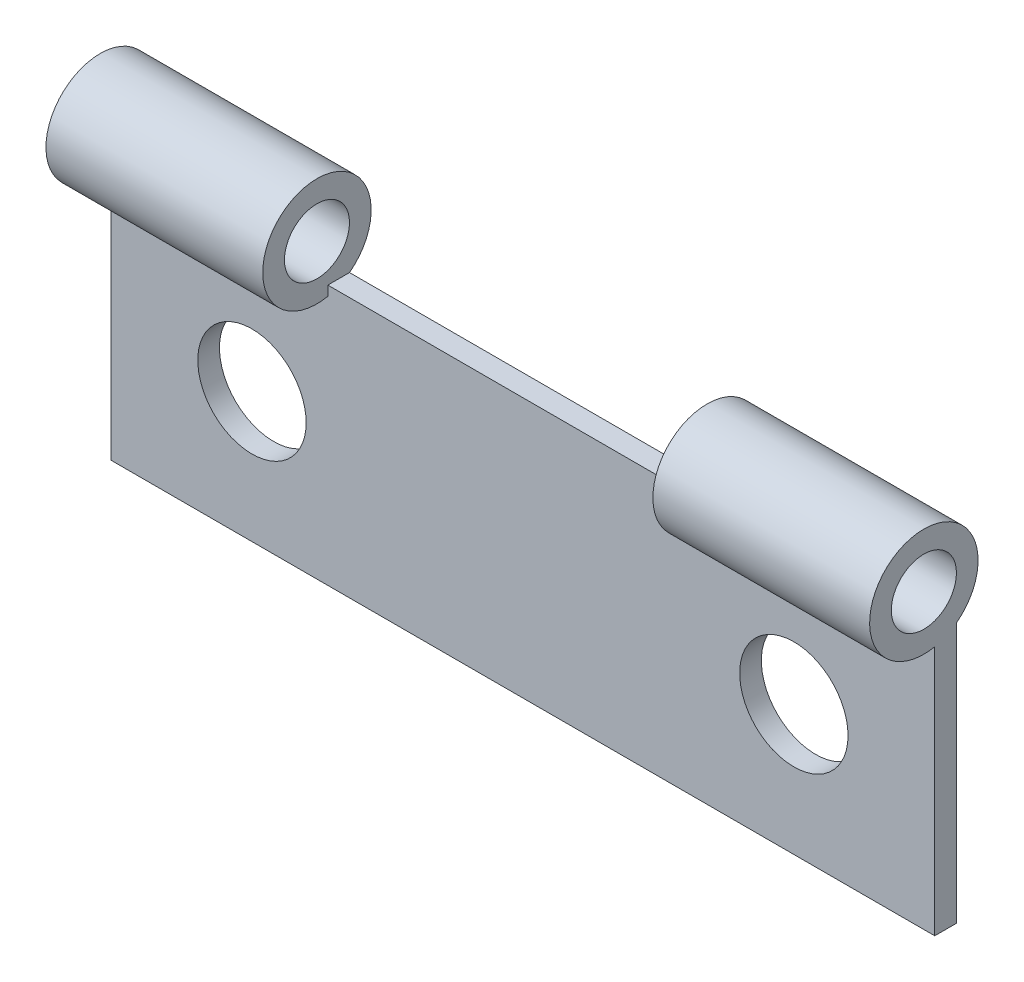
ISO-10303-21;
HEADER;
FILE_DESCRIPTION(('STEP AP214'),'2;1');
FILE_NAME('part.step','',(''),(''),'','','');
FILE_SCHEMA(('AUTOMOTIVE_DESIGN { 1 0 10303 214 1 1 1 1 }'));
ENDSEC;
DATA;
#1=APPLICATION_CONTEXT('core data for automotive mechanical design processes');
#2=APPLICATION_PROTOCOL_DEFINITION('international standard','automotive_design',2000,#1);
#3=PRODUCT_CONTEXT('',#1,'mechanical');
#4=PRODUCT('Part','Part','',(#3));
#5=PRODUCT_RELATED_PRODUCT_CATEGORY('part','',(#4));
#6=PRODUCT_DEFINITION_FORMATION('','',#4);
#7=PRODUCT_DEFINITION_CONTEXT('part definition',#1,'design');
#8=PRODUCT_DEFINITION('design','',#6,#7);
#9=PRODUCT_DEFINITION_SHAPE('','',#8);
#10=(LENGTH_UNIT() NAMED_UNIT(*) SI_UNIT(.MILLI.,.METRE.));
#11=(NAMED_UNIT(*) PLANE_ANGLE_UNIT() SI_UNIT($,.RADIAN.));
#12=(NAMED_UNIT(*) SI_UNIT($,.STERADIAN.) SOLID_ANGLE_UNIT());
#13=UNCERTAINTY_MEASURE_WITH_UNIT(LENGTH_MEASURE(1.E-05),#10,'distance_accuracy_value','');
#14=(GEOMETRIC_REPRESENTATION_CONTEXT(3) GLOBAL_UNCERTAINTY_ASSIGNED_CONTEXT((#13)) GLOBAL_UNIT_ASSIGNED_CONTEXT((#10,
#11,#12)) REPRESENTATION_CONTEXT('',''));
#15=CARTESIAN_POINT('',(0.,0.,0.));
#16=DIRECTION('',(0.,0.,1.));
#17=DIRECTION('',(1.,0.,0.));
#18=AXIS2_PLACEMENT_3D('',#15,#16,#17);
#19=CARTESIAN_POINT('',(0.,0.,1.));
#20=DIRECTION('',(0.,0.,-1.));
#21=DIRECTION('',(-1.,0.,0.));
#22=AXIS2_PLACEMENT_3D('',#19,#20,#21);
#23=PLANE('',#22);
#24=CARTESIAN_POINT('',(12.5,0.,1.));
#25=DIRECTION('',(0.,0.,1.));
#26=DIRECTION('',(1.,0.,0.));
#27=AXIS2_PLACEMENT_3D('',#24,#25,#26);
#28=CIRCLE('',#27,2.5);
#29=CARTESIAN_POINT('',(15.,0.,1.));
#30=VERTEX_POINT('',#29);
#31=EDGE_CURVE('E148',#30,#30,#28,.T.);
#32=ORIENTED_EDGE('',*,*,#31,.F.);
#33=EDGE_LOOP('',(#32));
#34=FACE_BOUND('',#33,.T.);
#35=CARTESIAN_POINT('',(-12.5,0.,1.));
#36=DIRECTION('',(0.,0.,1.));
#37=DIRECTION('',(1.,0.,0.));
#38=AXIS2_PLACEMENT_3D('',#35,#36,#37);
#39=CIRCLE('',#38,2.5);
#40=CARTESIAN_POINT('',(-10.,0.,1.));
#41=VERTEX_POINT('',#40);
#42=EDGE_CURVE('E142',#41,#41,#39,.T.);
#43=ORIENTED_EDGE('',*,*,#42,.F.);
#44=EDGE_LOOP('',(#43));
#45=FACE_BOUND('',#44,.T.);
#46=DIRECTION('',(0.,-1.,0.));
#47=VECTOR('',#46,1.);
#48=CARTESIAN_POINT('',(9.,0.,1.));
#49=LINE('',#48,#47);
#50=CARTESIAN_POINT('',(9.,6.,1.));
#51=VERTEX_POINT('',#50);
#52=CARTESIAN_POINT('',(9.,5.55084963734132,1.));
#53=VERTEX_POINT('',#52);
#54=EDGE_CURVE('E51',#51,#53,#49,.T.);
#55=ORIENTED_EDGE('',*,*,#54,.F.);
#56=DIRECTION('',(-1.,0.,0.));
#57=VECTOR('',#56,1.);
#58=CARTESIAN_POINT('',(-19.,6.,1.));
#59=LINE('',#58,#57);
#60=CARTESIAN_POINT('',(-9.,6.,1.));
#61=VERTEX_POINT('',#60);
#62=EDGE_CURVE('E98',#51,#61,#59,.T.);
#63=ORIENTED_EDGE('',*,*,#62,.T.);
#64=DIRECTION('',(0.,1.,0.));
#65=VECTOR('',#64,1.);
#66=CARTESIAN_POINT('',(-9.,0.,1.));
#67=LINE('',#66,#65);
#68=CARTESIAN_POINT('',(-9.,5.55084963734132,1.));
#69=VERTEX_POINT('',#68);
#70=EDGE_CURVE('E138',#69,#61,#67,.T.);
#71=ORIENTED_EDGE('',*,*,#70,.F.);
#72=DIRECTION('',(1.,0.,0.));
#73=VECTOR('',#72,1.);
#74=CARTESIAN_POINT('',(-19.,5.55084963734132,1.));
#75=LINE('',#74,#73);
#76=CARTESIAN_POINT('',(-19.,5.55084963734132,1.));
#77=VERTEX_POINT('',#76);
#78=EDGE_CURVE('E135',#77,#69,#75,.T.);
#79=ORIENTED_EDGE('',*,*,#78,.F.);
#80=DIRECTION('',(0.,-1.,0.));
#81=VECTOR('',#80,1.);
#82=CARTESIAN_POINT('',(-19.,-6.,1.));
#83=LINE('',#82,#81);
#84=CARTESIAN_POINT('',(-19.,-6.,1.));
#85=VERTEX_POINT('',#84);
#86=EDGE_CURVE('E158',#77,#85,#83,.T.);
#87=ORIENTED_EDGE('',*,*,#86,.T.);
#88=DIRECTION('',(1.,0.,0.));
#89=VECTOR('',#88,1.);
#90=CARTESIAN_POINT('',(-19.,-6.,1.));
#91=LINE('',#90,#89);
#92=CARTESIAN_POINT('',(19.,-6.,1.));
#93=VERTEX_POINT('',#92);
#94=EDGE_CURVE('E160',#85,#93,#91,.T.);
#95=ORIENTED_EDGE('',*,*,#94,.T.);
#96=DIRECTION('',(0.,1.,0.));
#97=VECTOR('',#96,1.);
#98=CARTESIAN_POINT('',(19.,-6.,1.));
#99=LINE('',#98,#97);
#100=CARTESIAN_POINT('',(19.,5.55084963734132,1.));
#101=VERTEX_POINT('',#100);
#102=EDGE_CURVE('E154',#93,#101,#99,.T.);
#103=ORIENTED_EDGE('',*,*,#102,.T.);
#104=DIRECTION('',(-1.,0.,0.));
#105=VECTOR('',#104,1.);
#106=CARTESIAN_POINT('',(19.,5.55084963734132,1.));
#107=LINE('',#106,#105);
#108=EDGE_CURVE('E47',#53,#101,#107,.F.);
#109=ORIENTED_EDGE('',*,*,#108,.F.);
#110=EDGE_LOOP('',(#55,#63,#71,#79,#87,#95,#103,#109));
#111=FACE_BOUND('',#110,.T.);
#112=ADVANCED_FACE('F32',(#34,#45,#111),#23,.F.);
#113=CARTESIAN_POINT('',(-19.,6.,1.));
#114=DIRECTION('',(0.,-1.,0.));
#115=DIRECTION('',(0.,0.,-1.));
#116=AXIS2_PLACEMENT_3D('',#113,#114,#115);
#117=PLANE('',#116);
#118=DIRECTION('',(0.,0.,1.));
#119=VECTOR('',#118,1.);
#120=CARTESIAN_POINT('',(9.,6.,1.));
#121=LINE('',#120,#119);
#122=CARTESIAN_POINT('',(9.,6.,0.00123140658122895));
#123=VERTEX_POINT('',#122);
#124=EDGE_CURVE('E11',#123,#51,#121,.T.);
#125=ORIENTED_EDGE('',*,*,#124,.F.);
#126=DIRECTION('',(-1.,0.,0.));
#127=VECTOR('',#126,1.);
#128=CARTESIAN_POINT('',(19.,6.,0.00123140658122851));
#129=LINE('',#128,#127);
#130=CARTESIAN_POINT('',(19.,6.,0.00123140658122851));
#131=VERTEX_POINT('',#130);
#132=EDGE_CURVE('E95',#131,#123,#129,.T.);
#133=ORIENTED_EDGE('',*,*,#132,.F.);
#134=DIRECTION('',(0.,0.,-1.));
#135=VECTOR('',#134,1.);
#136=CARTESIAN_POINT('',(19.,6.,1.));
#137=LINE('',#136,#135);
#138=CARTESIAN_POINT('',(19.,6.,0.));
#139=VERTEX_POINT('',#138);
#140=EDGE_CURVE('E178',#131,#139,#137,.T.);
#141=ORIENTED_EDGE('',*,*,#140,.T.);
#142=DIRECTION('',(-1.,0.,0.));
#143=VECTOR('',#142,1.);
#144=CARTESIAN_POINT('',(-19.,6.,0.));
#145=LINE('',#144,#143);
#146=CARTESIAN_POINT('',(-19.,6.,0.));
#147=VERTEX_POINT('',#146);
#148=EDGE_CURVE('E165',#139,#147,#145,.T.);
#149=ORIENTED_EDGE('',*,*,#148,.T.);
#150=DIRECTION('',(0.,0.,-1.));
#151=VECTOR('',#150,1.);
#152=CARTESIAN_POINT('',(-19.,6.,1.));
#153=LINE('',#152,#151);
#154=CARTESIAN_POINT('',(-19.,6.,0.00123140658122895));
#155=VERTEX_POINT('',#154);
#156=EDGE_CURVE('E176',#155,#147,#153,.T.);
#157=ORIENTED_EDGE('',*,*,#156,.F.);
#158=DIRECTION('',(1.,0.,0.));
#159=VECTOR('',#158,1.);
#160=CARTESIAN_POINT('',(-19.,6.,0.00123140658122851));
#161=LINE('',#160,#159);
#162=CARTESIAN_POINT('',(-9.,6.,0.00123140658122851));
#163=VERTEX_POINT('',#162);
#164=EDGE_CURVE('E130',#163,#155,#161,.F.);
#165=ORIENTED_EDGE('',*,*,#164,.F.);
#166=DIRECTION('',(0.,0.,-1.));
#167=VECTOR('',#166,1.);
#168=CARTESIAN_POINT('',(-9.,6.,1.));
#169=LINE('',#168,#167);
#170=EDGE_CURVE('E40',#61,#163,#169,.T.);
#171=ORIENTED_EDGE('',*,*,#170,.F.);
#172=ORIENTED_EDGE('',*,*,#62,.F.);
#173=EDGE_LOOP('',(#125,#133,#141,#149,#157,#165,#171,#172));
#174=FACE_BOUND('',#173,.T.);
#175=ADVANCED_FACE('F94',(#174),#117,.F.);
#176=CARTESIAN_POINT('',(0.,0.,0.));
#177=DIRECTION('',(0.,0.,-1.));
#178=DIRECTION('',(-1.,0.,0.));
#179=AXIS2_PLACEMENT_3D('',#176,#177,#178);
#180=PLANE('',#179);
#181=CARTESIAN_POINT('',(12.5,0.,0.));
#182=DIRECTION('',(0.,0.,1.));
#183=DIRECTION('',(1.,0.,0.));
#184=AXIS2_PLACEMENT_3D('',#181,#182,#183);
#185=CIRCLE('',#184,2.5);
#186=CARTESIAN_POINT('',(15.,0.,0.));
#187=VERTEX_POINT('',#186);
#188=EDGE_CURVE('E145',#187,#187,#185,.T.);
#189=ORIENTED_EDGE('',*,*,#188,.T.);
#190=EDGE_LOOP('',(#189));
#191=FACE_BOUND('',#190,.T.);
#192=DIRECTION('',(0.,1.,0.));
#193=VECTOR('',#192,1.);
#194=CARTESIAN_POINT('',(19.,-6.,0.));
#195=LINE('',#194,#193);
#196=CARTESIAN_POINT('',(19.,-6.,0.));
#197=VERTEX_POINT('',#196);
#198=EDGE_CURVE('E151',#197,#139,#195,.T.);
#199=ORIENTED_EDGE('',*,*,#198,.F.);
#200=DIRECTION('',(1.,0.,0.));
#201=VECTOR('',#200,1.);
#202=CARTESIAN_POINT('',(-19.,-6.,0.));
#203=LINE('',#202,#201);
#204=CARTESIAN_POINT('',(-19.,-6.,0.));
#205=VERTEX_POINT('',#204);
#206=EDGE_CURVE('E156',#205,#197,#203,.T.);
#207=ORIENTED_EDGE('',*,*,#206,.F.);
#208=DIRECTION('',(0.,-1.,0.));
#209=VECTOR('',#208,1.);
#210=CARTESIAN_POINT('',(-19.,-6.,0.));
#211=LINE('',#210,#209);
#212=EDGE_CURVE('E168',#147,#205,#211,.T.);
#213=ORIENTED_EDGE('',*,*,#212,.F.);
#214=ORIENTED_EDGE('',*,*,#148,.F.);
#215=EDGE_LOOP('',(#199,#207,#213,#214));
#216=FACE_BOUND('',#215,.T.);
#217=CARTESIAN_POINT('',(-12.5,0.,0.));
#218=DIRECTION('',(0.,0.,1.));
#219=DIRECTION('',(1.,0.,0.));
#220=AXIS2_PLACEMENT_3D('',#217,#218,#219);
#221=CIRCLE('',#220,2.5);
#222=CARTESIAN_POINT('',(-10.,0.,0.));
#223=VERTEX_POINT('',#222);
#224=EDGE_CURVE('E141',#223,#223,#221,.T.);
#225=ORIENTED_EDGE('',*,*,#224,.T.);
#226=EDGE_LOOP('',(#225));
#227=FACE_BOUND('',#226,.T.);
#228=ADVANCED_FACE('F203',(#191,#216,#227),#180,.T.);
#229=CARTESIAN_POINT('',(19.,-6.,1.));
#230=DIRECTION('',(-1.,0.,0.));
#231=DIRECTION('',(0.,0.,1.));
#232=AXIS2_PLACEMENT_3D('',#229,#230,#231);
#233=PLANE('',#232);
#234=ORIENTED_EDGE('',*,*,#140,.F.);
#235=CARTESIAN_POINT('',(19.,8.00184692044318,1.50184692044318));
#236=DIRECTION('',(1.,0.,0.));
#237=DIRECTION('',(0.,0.,-1.));
#238=AXIS2_PLACEMENT_3D('',#235,#236,#237);
#239=CIRCLE('',#238,2.50184692044318);
#240=EDGE_CURVE('E107',#131,#101,#239,.T.);
#241=ORIENTED_EDGE('',*,*,#240,.T.);
#242=ORIENTED_EDGE('',*,*,#102,.F.);
#243=DIRECTION('',(0.,0.,-1.));
#244=VECTOR('',#243,1.);
#245=CARTESIAN_POINT('',(19.,-6.,1.));
#246=LINE('',#245,#244);
#247=EDGE_CURVE('E162',#93,#197,#246,.T.);
#248=ORIENTED_EDGE('',*,*,#247,.T.);
#249=ORIENTED_EDGE('',*,*,#198,.T.);
#250=EDGE_LOOP('',(#234,#241,#242,#248,#249));
#251=FACE_BOUND('',#250,.T.);
#252=CARTESIAN_POINT('',(19.,8.00184692044318,1.50184692044318));
#253=DIRECTION('',(1.,0.,0.));
#254=DIRECTION('',(0.,0.,-1.));
#255=AXIS2_PLACEMENT_3D('',#252,#253,#254);
#256=CIRCLE('',#255,1.50184692044318);
#257=CARTESIAN_POINT('',(19.,8.00184692044318,0.));
#258=VERTEX_POINT('',#257);
#259=EDGE_CURVE('E110',#258,#258,#256,.T.);
#260=ORIENTED_EDGE('',*,*,#259,.F.);
#261=EDGE_LOOP('',(#260));
#262=FACE_BOUND('',#261,.T.);
#263=ADVANCED_FACE('F34',(#251,#262),#233,.F.);
#264=CARTESIAN_POINT('',(-19.,-6.,1.));
#265=DIRECTION('',(1.,0.,0.));
#266=DIRECTION('',(0.,0.,-1.));
#267=AXIS2_PLACEMENT_3D('',#264,#265,#266);
#268=PLANE('',#267);
#269=ORIENTED_EDGE('',*,*,#86,.F.);
#270=CARTESIAN_POINT('',(-19.,8.00184692044318,1.50184692044318));
#271=DIRECTION('',(-1.,0.,0.));
#272=DIRECTION('',(0.,0.,1.));
#273=AXIS2_PLACEMENT_3D('',#270,#271,#272);
#274=CIRCLE('',#273,2.50184692044318);
#275=EDGE_CURVE('E127',#77,#155,#274,.T.);
#276=ORIENTED_EDGE('',*,*,#275,.T.);
#277=ORIENTED_EDGE('',*,*,#156,.T.);
#278=ORIENTED_EDGE('',*,*,#212,.T.);
#279=DIRECTION('',(0.,0.,-1.));
#280=VECTOR('',#279,1.);
#281=CARTESIAN_POINT('',(-19.,-6.,1.));
#282=LINE('',#281,#280);
#283=EDGE_CURVE('E173',#85,#205,#282,.T.);
#284=ORIENTED_EDGE('',*,*,#283,.F.);
#285=EDGE_LOOP('',(#269,#276,#277,#278,#284));
#286=FACE_BOUND('',#285,.T.);
#287=CARTESIAN_POINT('',(-19.,8.00184692044318,1.50184692044318));
#288=DIRECTION('',(-1.,0.,0.));
#289=DIRECTION('',(0.,0.,1.));
#290=AXIS2_PLACEMENT_3D('',#287,#288,#289);
#291=CIRCLE('',#290,1.5);
#292=CARTESIAN_POINT('',(-19.,8.00184692044318,3.00184692044318));
#293=VERTEX_POINT('',#292);
#294=EDGE_CURVE('E121',#293,#293,#291,.T.);
#295=ORIENTED_EDGE('',*,*,#294,.F.);
#296=EDGE_LOOP('',(#295));
#297=FACE_BOUND('',#296,.T.);
#298=ADVANCED_FACE('F189',(#286,#297),#268,.F.);
#299=CARTESIAN_POINT('',(-19.,-6.,1.));
#300=DIRECTION('',(0.,1.,0.));
#301=DIRECTION('',(0.,0.,1.));
#302=AXIS2_PLACEMENT_3D('',#299,#300,#301);
#303=PLANE('',#302);
#304=ORIENTED_EDGE('',*,*,#206,.T.);
#305=ORIENTED_EDGE('',*,*,#247,.F.);
#306=ORIENTED_EDGE('',*,*,#94,.F.);
#307=ORIENTED_EDGE('',*,*,#283,.T.);
#308=EDGE_LOOP('',(#304,#305,#306,#307));
#309=FACE_BOUND('',#308,.T.);
#310=ADVANCED_FACE('F196',(#309),#303,.F.);
#311=CARTESIAN_POINT('',(12.5,0.,1.));
#312=DIRECTION('',(0.,0.,-1.));
#313=DIRECTION('',(-1.,0.,0.));
#314=AXIS2_PLACEMENT_3D('',#311,#312,#313);
#315=CYLINDRICAL_SURFACE('',#314,2.5);
#316=ORIENTED_EDGE('',*,*,#31,.T.);
#317=EDGE_LOOP('',(#316));
#318=FACE_BOUND('',#317,.T.);
#319=ORIENTED_EDGE('',*,*,#188,.F.);
#320=EDGE_LOOP('',(#319));
#321=FACE_BOUND('',#320,.T.);
#322=ADVANCED_FACE('F212',(#318,#321),#315,.F.);
#323=CARTESIAN_POINT('',(-12.5,0.,1.));
#324=DIRECTION('',(0.,0.,-1.));
#325=DIRECTION('',(-1.,0.,0.));
#326=AXIS2_PLACEMENT_3D('',#323,#324,#325);
#327=CYLINDRICAL_SURFACE('',#326,2.5);
#328=ORIENTED_EDGE('',*,*,#42,.T.);
#329=EDGE_LOOP('',(#328));
#330=FACE_BOUND('',#329,.T.);
#331=ORIENTED_EDGE('',*,*,#224,.F.);
#332=EDGE_LOOP('',(#331));
#333=FACE_BOUND('',#332,.T.);
#334=ADVANCED_FACE('F210',(#330,#333),#327,.F.);
#335=CARTESIAN_POINT('',(-9.,8.00184692044318,1.50184692044318));
#336=DIRECTION('',(-1.,0.,0.));
#337=DIRECTION('',(0.,0.,1.));
#338=AXIS2_PLACEMENT_3D('',#335,#336,#337);
#339=PLANE('',#338);
#340=CARTESIAN_POINT('',(-9.,8.00184692044318,1.50184692044318));
#341=DIRECTION('',(-1.,0.,0.));
#342=DIRECTION('',(0.,0.,1.));
#343=AXIS2_PLACEMENT_3D('',#340,#341,#342);
#344=CIRCLE('',#343,1.5);
#345=CARTESIAN_POINT('',(-9.,8.00184692044318,3.00184692044318));
#346=VERTEX_POINT('',#345);
#347=EDGE_CURVE('E120',#346,#346,#344,.T.);
#348=ORIENTED_EDGE('',*,*,#347,.T.);
#349=EDGE_LOOP('',(#348));
#350=FACE_BOUND('',#349,.T.);
#351=CARTESIAN_POINT('',(-9.,8.00184692044318,1.50184692044318));
#352=DIRECTION('',(-1.,0.,0.));
#353=DIRECTION('',(0.,0.,1.));
#354=AXIS2_PLACEMENT_3D('',#351,#352,#353);
#355=CIRCLE('',#354,2.50184692044318);
#356=EDGE_CURVE('E124',#69,#163,#355,.T.);
#357=ORIENTED_EDGE('',*,*,#356,.F.);
#358=ORIENTED_EDGE('',*,*,#70,.T.);
#359=ORIENTED_EDGE('',*,*,#170,.T.);
#360=EDGE_LOOP('',(#357,#358,#359));
#361=FACE_BOUND('',#360,.T.);
#362=ADVANCED_FACE('F182',(#350,#361),#339,.F.);
#363=CARTESIAN_POINT('',(-19.,8.00184692044318,1.50184692044318));
#364=DIRECTION('',(1.,0.,0.));
#365=DIRECTION('',(0.,0.,-1.));
#366=AXIS2_PLACEMENT_3D('',#363,#364,#365);
#367=CYLINDRICAL_SURFACE('',#366,2.50184692044318);
#368=ORIENTED_EDGE('',*,*,#275,.F.);
#369=ORIENTED_EDGE('',*,*,#78,.T.);
#370=ORIENTED_EDGE('',*,*,#356,.T.);
#371=ORIENTED_EDGE('',*,*,#164,.T.);
#372=EDGE_LOOP('',(#368,#369,#370,#371));
#373=FACE_BOUND('',#372,.T.);
#374=ADVANCED_FACE('F185',(#373),#367,.T.);
#375=CARTESIAN_POINT('',(-19.,8.00184692044318,1.50184692044318));
#376=DIRECTION('',(1.,0.,0.));
#377=DIRECTION('',(0.,0.,-1.));
#378=AXIS2_PLACEMENT_3D('',#375,#376,#377);
#379=CYLINDRICAL_SURFACE('',#378,1.5);
#380=ORIENTED_EDGE('',*,*,#294,.T.);
#381=EDGE_LOOP('',(#380));
#382=FACE_BOUND('',#381,.T.);
#383=ORIENTED_EDGE('',*,*,#347,.F.);
#384=EDGE_LOOP('',(#383));
#385=FACE_BOUND('',#384,.T.);
#386=ADVANCED_FACE('F261',(#382,#385),#379,.F.);
#387=CARTESIAN_POINT('',(9.,8.00184692044318,1.50184692044318));
#388=DIRECTION('',(1.,0.,0.));
#389=DIRECTION('',(0.,0.,-1.));
#390=AXIS2_PLACEMENT_3D('',#387,#388,#389);
#391=PLANE('',#390);
#392=CARTESIAN_POINT('',(9.,8.00184692044318,1.50184692044318));
#393=DIRECTION('',(1.,0.,0.));
#394=DIRECTION('',(0.,0.,-1.));
#395=AXIS2_PLACEMENT_3D('',#392,#393,#394);
#396=CIRCLE('',#395,1.50184692044318);
#397=CARTESIAN_POINT('',(9.,8.00184692044318,0.));
#398=VERTEX_POINT('',#397);
#399=EDGE_CURVE('E114',#398,#398,#396,.T.);
#400=ORIENTED_EDGE('',*,*,#399,.T.);
#401=EDGE_LOOP('',(#400));
#402=FACE_BOUND('',#401,.T.);
#403=ORIENTED_EDGE('',*,*,#124,.T.);
#404=ORIENTED_EDGE('',*,*,#54,.T.);
#405=CARTESIAN_POINT('',(9.,8.00184692044318,1.50184692044318));
#406=DIRECTION('',(1.,0.,0.));
#407=DIRECTION('',(0.,0.,-1.));
#408=AXIS2_PLACEMENT_3D('',#405,#406,#407);
#409=CIRCLE('',#408,2.50184692044318);
#410=EDGE_CURVE('E105',#123,#53,#409,.T.);
#411=ORIENTED_EDGE('',*,*,#410,.F.);
#412=EDGE_LOOP('',(#403,#404,#411));
#413=FACE_BOUND('',#412,.T.);
#414=ADVANCED_FACE('F109',(#402,#413),#391,.F.);
#415=CARTESIAN_POINT('',(19.,8.00184692044318,1.50184692044318));
#416=DIRECTION('',(-1.,0.,0.));
#417=DIRECTION('',(0.,0.,1.));
#418=AXIS2_PLACEMENT_3D('',#415,#416,#417);
#419=CYLINDRICAL_SURFACE('',#418,2.50184692044318);
#420=ORIENTED_EDGE('',*,*,#410,.T.);
#421=ORIENTED_EDGE('',*,*,#108,.T.);
#422=ORIENTED_EDGE('',*,*,#240,.F.);
#423=ORIENTED_EDGE('',*,*,#132,.T.);
#424=EDGE_LOOP('',(#420,#421,#422,#423));
#425=FACE_BOUND('',#424,.T.);
#426=ADVANCED_FACE('F104',(#425),#419,.T.);
#427=CARTESIAN_POINT('',(19.,8.00184692044318,1.50184692044318));
#428=DIRECTION('',(-1.,0.,0.));
#429=DIRECTION('',(0.,0.,1.));
#430=AXIS2_PLACEMENT_3D('',#427,#428,#429);
#431=CYLINDRICAL_SURFACE('',#430,1.50184692044318);
#432=ORIENTED_EDGE('',*,*,#259,.T.);
#433=EDGE_LOOP('',(#432));
#434=FACE_BOUND('',#433,.T.);
#435=ORIENTED_EDGE('',*,*,#399,.F.);
#436=EDGE_LOOP('',(#435));
#437=FACE_BOUND('',#436,.T.);
#438=ADVANCED_FACE('F324',(#434,#437),#431,.F.);
#439=CLOSED_SHELL('',(#112,#175,#228,#263,#298,#310,#322,#334,#362,#374,#386,#414,#426,#438));
#440=MANIFOLD_SOLID_BREP('B2',#439);
#441=ADVANCED_BREP_SHAPE_REPRESENTATION('',(#18,#440),#14);
#442=SHAPE_DEFINITION_REPRESENTATION(#9,#441);
ENDSEC;
END-ISO-10303-21;
